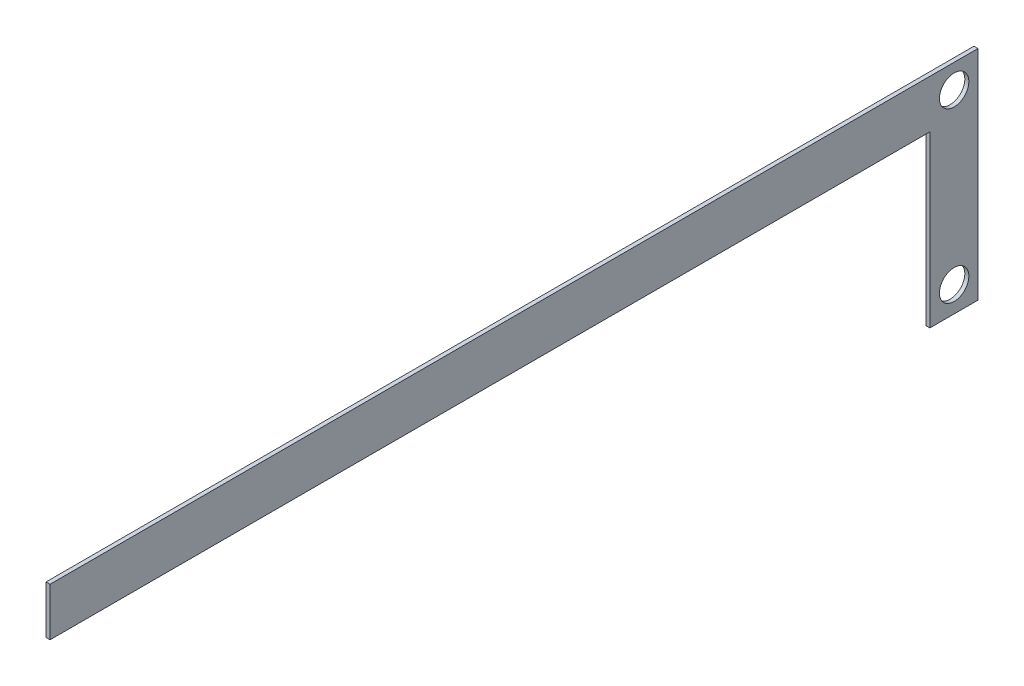
ISO-10303-21;
HEADER;
FILE_DESCRIPTION(('STEP AP214'),'2;1');
FILE_NAME('part.step','',(''),(''),'','','');
FILE_SCHEMA(('AUTOMOTIVE_DESIGN { 1 0 10303 214 1 1 1 1 }'));
ENDSEC;
DATA;
#1=APPLICATION_CONTEXT('core data for automotive mechanical design processes');
#2=APPLICATION_PROTOCOL_DEFINITION('international standard','automotive_design',2000,#1);
#3=PRODUCT_CONTEXT('',#1,'mechanical');
#4=PRODUCT('Part','Part','',(#3));
#5=PRODUCT_RELATED_PRODUCT_CATEGORY('part','',(#4));
#6=PRODUCT_DEFINITION_FORMATION('','',#4);
#7=PRODUCT_DEFINITION_CONTEXT('part definition',#1,'design');
#8=PRODUCT_DEFINITION('design','',#6,#7);
#9=PRODUCT_DEFINITION_SHAPE('','',#8);
#10=(LENGTH_UNIT() NAMED_UNIT(*) SI_UNIT(.MILLI.,.METRE.));
#11=(NAMED_UNIT(*) PLANE_ANGLE_UNIT() SI_UNIT($,.RADIAN.));
#12=(NAMED_UNIT(*) SI_UNIT($,.STERADIAN.) SOLID_ANGLE_UNIT());
#13=UNCERTAINTY_MEASURE_WITH_UNIT(LENGTH_MEASURE(1.E-05),#10,'distance_accuracy_value','');
#14=(GEOMETRIC_REPRESENTATION_CONTEXT(3) GLOBAL_UNCERTAINTY_ASSIGNED_CONTEXT((#13)) GLOBAL_UNIT_ASSIGNED_CONTEXT((#10,
#11,#12)) REPRESENTATION_CONTEXT('',''));
#15=CARTESIAN_POINT('',(0.,0.,0.));
#16=DIRECTION('',(0.,0.,1.));
#17=DIRECTION('',(1.,0.,0.));
#18=AXIS2_PLACEMENT_3D('',#15,#16,#17);
#19=CARTESIAN_POINT('',(0.3,0.,-65.8));
#20=DIRECTION('',(0.,1.,0.));
#21=DIRECTION('',(0.,0.,1.));
#22=AXIS2_PLACEMENT_3D('',#19,#20,#21);
#23=PLANE('',#22);
#24=DIRECTION('',(0.,0.,-1.));
#25=VECTOR('',#24,1.);
#26=CARTESIAN_POINT('',(0.,0.,-65.8));
#27=LINE('',#26,#25);
#28=CARTESIAN_POINT('',(0.,0.,0.));
#29=VERTEX_POINT('',#28);
#30=CARTESIAN_POINT('',(0.,0.,-65.8));
#31=VERTEX_POINT('',#30);
#32=EDGE_CURVE('E127',#29,#31,#27,.T.);
#33=ORIENTED_EDGE('',*,*,#32,.T.);
#34=DIRECTION('',(-1.,0.,0.));
#35=VECTOR('',#34,1.);
#36=CARTESIAN_POINT('',(0.3,0.,-65.8));
#37=LINE('',#36,#35);
#38=CARTESIAN_POINT('',(0.3,0.,-65.8));
#39=VERTEX_POINT('',#38);
#40=EDGE_CURVE('E11',#39,#31,#37,.T.);
#41=ORIENTED_EDGE('',*,*,#40,.F.);
#42=DIRECTION('',(0.,0.,-1.));
#43=VECTOR('',#42,1.);
#44=CARTESIAN_POINT('',(0.3,0.,-65.8));
#45=LINE('',#44,#43);
#46=CARTESIAN_POINT('',(0.3,0.,0.));
#47=VERTEX_POINT('',#46);
#48=EDGE_CURVE('E144',#47,#39,#45,.T.);
#49=ORIENTED_EDGE('',*,*,#48,.F.);
#50=DIRECTION('',(-1.,0.,0.));
#51=VECTOR('',#50,1.);
#52=CARTESIAN_POINT('',(0.3,0.,0.));
#53=LINE('',#52,#51);
#54=EDGE_CURVE('E123',#47,#29,#53,.T.);
#55=ORIENTED_EDGE('',*,*,#54,.T.);
#56=EDGE_LOOP('',(#33,#41,#49,#55));
#57=FACE_BOUND('',#56,.T.);
#58=ADVANCED_FACE('F38',(#57),#23,.F.);
#59=CARTESIAN_POINT('',(0.3,-12.7,-65.8));
#60=DIRECTION('',(0.,0.,-1.));
#61=DIRECTION('',(-1.,0.,0.));
#62=AXIS2_PLACEMENT_3D('',#59,#60,#61);
#63=PLANE('',#62);
#64=DIRECTION('',(0.,-1.,0.));
#65=VECTOR('',#64,1.);
#66=CARTESIAN_POINT('',(0.,-12.7,-65.8));
#67=LINE('',#66,#65);
#68=CARTESIAN_POINT('',(0.,-12.7,-65.8));
#69=VERTEX_POINT('',#68);
#70=EDGE_CURVE('E131',#31,#69,#67,.T.);
#71=ORIENTED_EDGE('',*,*,#70,.T.);
#72=DIRECTION('',(-1.,0.,0.));
#73=VECTOR('',#72,1.);
#74=CARTESIAN_POINT('',(0.3,-12.7,-65.8));
#75=LINE('',#74,#73);
#76=CARTESIAN_POINT('',(0.3,-12.7,-65.8));
#77=VERTEX_POINT('',#76);
#78=EDGE_CURVE('E47',#77,#69,#75,.T.);
#79=ORIENTED_EDGE('',*,*,#78,.F.);
#80=DIRECTION('',(0.,-1.,0.));
#81=VECTOR('',#80,1.);
#82=CARTESIAN_POINT('',(0.3,-12.7,-65.8));
#83=LINE('',#82,#81);
#84=EDGE_CURVE('E92',#39,#77,#83,.T.);
#85=ORIENTED_EDGE('',*,*,#84,.F.);
#86=ORIENTED_EDGE('',*,*,#40,.T.);
#87=EDGE_LOOP('',(#71,#79,#85,#86));
#88=FACE_BOUND('',#87,.T.);
#89=ADVANCED_FACE('F173',(#88),#63,.F.);
#90=CARTESIAN_POINT('',(0.3,-12.7,-69.4));
#91=DIRECTION('',(0.,1.,0.));
#92=DIRECTION('',(0.,0.,1.));
#93=AXIS2_PLACEMENT_3D('',#90,#91,#92);
#94=PLANE('',#93);
#95=DIRECTION('',(0.,0.,-1.));
#96=VECTOR('',#95,1.);
#97=CARTESIAN_POINT('',(0.,-12.7,-69.4));
#98=LINE('',#97,#96);
#99=CARTESIAN_POINT('',(0.,-12.7,-69.4));
#100=VERTEX_POINT('',#99);
#101=EDGE_CURVE('E135',#69,#100,#98,.T.);
#102=ORIENTED_EDGE('',*,*,#101,.T.);
#103=DIRECTION('',(-1.,0.,0.));
#104=VECTOR('',#103,1.);
#105=CARTESIAN_POINT('',(0.3,-12.7,-69.4));
#106=LINE('',#105,#104);
#107=CARTESIAN_POINT('',(0.3,-12.7,-69.4));
#108=VERTEX_POINT('',#107);
#109=EDGE_CURVE('E116',#108,#100,#106,.T.);
#110=ORIENTED_EDGE('',*,*,#109,.F.);
#111=DIRECTION('',(0.,0.,-1.));
#112=VECTOR('',#111,1.);
#113=CARTESIAN_POINT('',(0.3,-12.7,-69.4));
#114=LINE('',#113,#112);
#115=EDGE_CURVE('E105',#77,#108,#114,.T.);
#116=ORIENTED_EDGE('',*,*,#115,.F.);
#117=ORIENTED_EDGE('',*,*,#78,.T.);
#118=EDGE_LOOP('',(#102,#110,#116,#117));
#119=FACE_BOUND('',#118,.T.);
#120=ADVANCED_FACE('F154',(#119),#94,.F.);
#121=CARTESIAN_POINT('',(0.3,3.6,-69.4));
#122=DIRECTION('',(0.,0.,1.));
#123=DIRECTION('',(0.,-1.,0.));
#124=AXIS2_PLACEMENT_3D('',#121,#122,#123);
#125=PLANE('',#124);
#126=DIRECTION('',(0.,1.,0.));
#127=VECTOR('',#126,1.);
#128=CARTESIAN_POINT('',(0.,3.6,-69.4));
#129=LINE('',#128,#127);
#130=CARTESIAN_POINT('',(0.,3.6,-69.4));
#131=VERTEX_POINT('',#130);
#132=EDGE_CURVE('E114',#100,#131,#129,.T.);
#133=ORIENTED_EDGE('',*,*,#132,.T.);
#134=DIRECTION('',(-1.,0.,0.));
#135=VECTOR('',#134,1.);
#136=CARTESIAN_POINT('',(0.3,3.6,-69.4));
#137=LINE('',#136,#135);
#138=CARTESIAN_POINT('',(0.3,3.6,-69.4));
#139=VERTEX_POINT('',#138);
#140=EDGE_CURVE('E111',#139,#131,#137,.T.);
#141=ORIENTED_EDGE('',*,*,#140,.F.);
#142=DIRECTION('',(0.,1.,0.));
#143=VECTOR('',#142,1.);
#144=CARTESIAN_POINT('',(0.3,3.6,-69.4));
#145=LINE('',#144,#143);
#146=EDGE_CURVE('E99',#108,#139,#145,.T.);
#147=ORIENTED_EDGE('',*,*,#146,.F.);
#148=ORIENTED_EDGE('',*,*,#109,.T.);
#149=EDGE_LOOP('',(#133,#141,#147,#148));
#150=FACE_BOUND('',#149,.T.);
#151=ADVANCED_FACE('F112',(#150),#125,.F.);
#152=CARTESIAN_POINT('',(0.3,3.6,0.));
#153=DIRECTION('',(0.,-1.,0.));
#154=DIRECTION('',(0.,0.,-1.));
#155=AXIS2_PLACEMENT_3D('',#152,#153,#154);
#156=PLANE('',#155);
#157=DIRECTION('',(0.,0.,1.));
#158=VECTOR('',#157,1.);
#159=CARTESIAN_POINT('',(0.,3.6,0.));
#160=LINE('',#159,#158);
#161=CARTESIAN_POINT('',(0.,3.6,0.));
#162=VERTEX_POINT('',#161);
#163=EDGE_CURVE('E78',#131,#162,#160,.T.);
#164=ORIENTED_EDGE('',*,*,#163,.T.);
#165=DIRECTION('',(-1.,0.,0.));
#166=VECTOR('',#165,1.);
#167=CARTESIAN_POINT('',(0.3,3.6,0.));
#168=LINE('',#167,#166);
#169=CARTESIAN_POINT('',(0.3,3.6,0.));
#170=VERTEX_POINT('',#169);
#171=EDGE_CURVE('E117',#170,#162,#168,.T.);
#172=ORIENTED_EDGE('',*,*,#171,.F.);
#173=DIRECTION('',(0.,0.,1.));
#174=VECTOR('',#173,1.);
#175=CARTESIAN_POINT('',(0.3,3.6,0.));
#176=LINE('',#175,#174);
#177=EDGE_CURVE('E103',#139,#170,#176,.T.);
#178=ORIENTED_EDGE('',*,*,#177,.F.);
#179=ORIENTED_EDGE('',*,*,#140,.T.);
#180=EDGE_LOOP('',(#164,#172,#178,#179));
#181=FACE_BOUND('',#180,.T.);
#182=ADVANCED_FACE('F119',(#181),#156,.F.);
#183=CARTESIAN_POINT('',(0.3,0.,0.));
#184=DIRECTION('',(0.,0.,-1.));
#185=DIRECTION('',(-1.,0.,0.));
#186=AXIS2_PLACEMENT_3D('',#183,#184,#185);
#187=PLANE('',#186);
#188=DIRECTION('',(0.,-1.,0.));
#189=VECTOR('',#188,1.);
#190=CARTESIAN_POINT('',(0.,0.,0.));
#191=LINE('',#190,#189);
#192=EDGE_CURVE('E84',#162,#29,#191,.T.);
#193=ORIENTED_EDGE('',*,*,#192,.T.);
#194=ORIENTED_EDGE('',*,*,#54,.F.);
#195=DIRECTION('',(0.,-1.,0.));
#196=VECTOR('',#195,1.);
#197=CARTESIAN_POINT('',(0.3,0.,0.));
#198=LINE('',#197,#196);
#199=EDGE_CURVE('E55',#170,#47,#198,.T.);
#200=ORIENTED_EDGE('',*,*,#199,.F.);
#201=ORIENTED_EDGE('',*,*,#171,.T.);
#202=EDGE_LOOP('',(#193,#194,#200,#201));
#203=FACE_BOUND('',#202,.T.);
#204=ADVANCED_FACE('F161',(#203),#187,.F.);
#205=CARTESIAN_POINT('',(0.3,0.,0.));
#206=DIRECTION('',(-1.,0.,0.));
#207=DIRECTION('',(0.,0.,1.));
#208=AXIS2_PLACEMENT_3D('',#205,#206,#207);
#209=PLANE('',#208);
#210=CARTESIAN_POINT('',(0.3,1.805,-67.6145));
#211=DIRECTION('',(1.,0.,0.));
#212=DIRECTION('',(0.,0.,-1.));
#213=AXIS2_PLACEMENT_3D('',#210,#211,#212);
#214=CIRCLE('',#213,1.10000000000001);
#215=CARTESIAN_POINT('',(0.3,1.805,-68.7145));
#216=VERTEX_POINT('',#215);
#217=EDGE_CURVE('E238',#216,#216,#214,.T.);
#218=ORIENTED_EDGE('',*,*,#217,.F.);
#219=EDGE_LOOP('',(#218));
#220=FACE_BOUND('',#219,.T.);
#221=CARTESIAN_POINT('',(0.3,-10.795,-67.6145));
#222=DIRECTION('',(1.,0.,0.));
#223=DIRECTION('',(0.,0.,-1.));
#224=AXIS2_PLACEMENT_3D('',#221,#222,#223);
#225=CIRCLE('',#224,1.10000000000001);
#226=CARTESIAN_POINT('',(0.3,-10.795,-68.7145));
#227=VERTEX_POINT('',#226);
#228=EDGE_CURVE('E246',#227,#227,#225,.T.);
#229=ORIENTED_EDGE('',*,*,#228,.F.);
#230=EDGE_LOOP('',(#229));
#231=FACE_BOUND('',#230,.T.);
#232=ORIENTED_EDGE('',*,*,#48,.T.);
#233=ORIENTED_EDGE('',*,*,#84,.T.);
#234=ORIENTED_EDGE('',*,*,#115,.T.);
#235=ORIENTED_EDGE('',*,*,#146,.T.);
#236=ORIENTED_EDGE('',*,*,#177,.T.);
#237=ORIENTED_EDGE('',*,*,#199,.T.);
#238=EDGE_LOOP('',(#232,#233,#234,#235,#236,#237));
#239=FACE_BOUND('',#238,.T.);
#240=ADVANCED_FACE('F101',(#220,#231,#239),#209,.F.);
#241=CARTESIAN_POINT('',(0.,0.,0.));
#242=DIRECTION('',(-1.,0.,0.));
#243=DIRECTION('',(0.,0.,1.));
#244=AXIS2_PLACEMENT_3D('',#241,#242,#243);
#245=PLANE('',#244);
#246=CARTESIAN_POINT('',(0.,1.805,-67.6145));
#247=DIRECTION('',(1.,0.,0.));
#248=DIRECTION('',(0.,0.,-1.));
#249=AXIS2_PLACEMENT_3D('',#246,#247,#248);
#250=CIRCLE('',#249,1.10000000000001);
#251=CARTESIAN_POINT('',(0.,1.805,-68.7145));
#252=VERTEX_POINT('',#251);
#253=EDGE_CURVE('E132',#252,#252,#250,.T.);
#254=ORIENTED_EDGE('',*,*,#253,.T.);
#255=EDGE_LOOP('',(#254));
#256=FACE_BOUND('',#255,.T.);
#257=CARTESIAN_POINT('',(0.,-10.795,-67.6145));
#258=DIRECTION('',(1.,0.,0.));
#259=DIRECTION('',(0.,0.,-1.));
#260=AXIS2_PLACEMENT_3D('',#257,#258,#259);
#261=CIRCLE('',#260,1.10000000000001);
#262=CARTESIAN_POINT('',(0.,-10.795,-68.7145));
#263=VERTEX_POINT('',#262);
#264=EDGE_CURVE('E240',#263,#263,#261,.T.);
#265=ORIENTED_EDGE('',*,*,#264,.T.);
#266=EDGE_LOOP('',(#265));
#267=FACE_BOUND('',#266,.T.);
#268=ORIENTED_EDGE('',*,*,#32,.F.);
#269=ORIENTED_EDGE('',*,*,#192,.F.);
#270=ORIENTED_EDGE('',*,*,#163,.F.);
#271=ORIENTED_EDGE('',*,*,#132,.F.);
#272=ORIENTED_EDGE('',*,*,#101,.F.);
#273=ORIENTED_EDGE('',*,*,#70,.F.);
#274=EDGE_LOOP('',(#268,#269,#270,#271,#272,#273));
#275=FACE_BOUND('',#274,.T.);
#276=ADVANCED_FACE('F157',(#256,#267,#275),#245,.T.);
#277=CARTESIAN_POINT('',(0.,-10.795,-67.6145));
#278=DIRECTION('',(1.,0.,0.));
#279=DIRECTION('',(0.,0.,-1.));
#280=AXIS2_PLACEMENT_3D('',#277,#278,#279);
#281=CYLINDRICAL_SURFACE('',#280,1.10000000000001);
#282=ORIENTED_EDGE('',*,*,#264,.F.);
#283=EDGE_LOOP('',(#282));
#284=FACE_BOUND('',#283,.T.);
#285=ORIENTED_EDGE('',*,*,#228,.T.);
#286=EDGE_LOOP('',(#285));
#287=FACE_BOUND('',#286,.T.);
#288=ADVANCED_FACE('F210',(#284,#287),#281,.F.);
#289=CARTESIAN_POINT('',(0.,1.805,-67.6145));
#290=DIRECTION('',(1.,0.,0.));
#291=DIRECTION('',(0.,0.,-1.));
#292=AXIS2_PLACEMENT_3D('',#289,#290,#291);
#293=CYLINDRICAL_SURFACE('',#292,1.10000000000001);
#294=ORIENTED_EDGE('',*,*,#253,.F.);
#295=EDGE_LOOP('',(#294));
#296=FACE_BOUND('',#295,.T.);
#297=ORIENTED_EDGE('',*,*,#217,.T.);
#298=EDGE_LOOP('',(#297));
#299=FACE_BOUND('',#298,.T.);
#300=ADVANCED_FACE('F219',(#296,#299),#293,.F.);
#301=CLOSED_SHELL('',(#58,#89,#120,#151,#182,#204,#240,#276,#288,#300));
#302=MANIFOLD_SOLID_BREP('B2',#301);
#303=ADVANCED_BREP_SHAPE_REPRESENTATION('',(#18,#302),#14);
#304=SHAPE_DEFINITION_REPRESENTATION(#9,#303);
ENDSEC;
END-ISO-10303-21;
